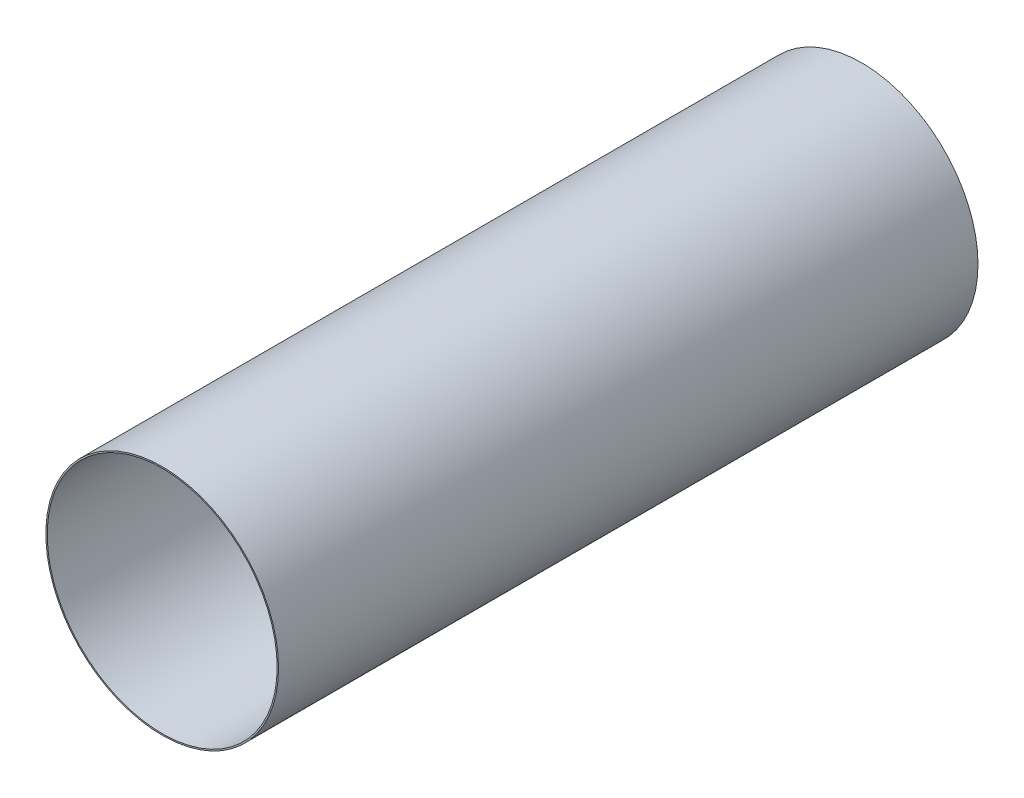
ISO-10303-21;
HEADER;
FILE_DESCRIPTION(('STEP AP214'),'2;1');
FILE_NAME('part.step','',(''),(''),'','','');
FILE_SCHEMA(('AUTOMOTIVE_DESIGN { 1 0 10303 214 1 1 1 1 }'));
ENDSEC;
DATA;
#1=APPLICATION_CONTEXT('core data for automotive mechanical design processes');
#2=APPLICATION_PROTOCOL_DEFINITION('international standard','automotive_design',2000,#1);
#3=PRODUCT_CONTEXT('',#1,'mechanical');
#4=PRODUCT('Part','Part','',(#3));
#5=PRODUCT_RELATED_PRODUCT_CATEGORY('part','',(#4));
#6=PRODUCT_DEFINITION_FORMATION('','',#4);
#7=PRODUCT_DEFINITION_CONTEXT('part definition',#1,'design');
#8=PRODUCT_DEFINITION('design','',#6,#7);
#9=PRODUCT_DEFINITION_SHAPE('','',#8);
#10=(LENGTH_UNIT() NAMED_UNIT(*) SI_UNIT(.MILLI.,.METRE.));
#11=(NAMED_UNIT(*) PLANE_ANGLE_UNIT() SI_UNIT($,.RADIAN.));
#12=(NAMED_UNIT(*) SI_UNIT($,.STERADIAN.) SOLID_ANGLE_UNIT());
#13=UNCERTAINTY_MEASURE_WITH_UNIT(LENGTH_MEASURE(1.E-05),#10,'distance_accuracy_value','');
#14=(GEOMETRIC_REPRESENTATION_CONTEXT(3) GLOBAL_UNCERTAINTY_ASSIGNED_CONTEXT((#13)) GLOBAL_UNIT_ASSIGNED_CONTEXT((#10,
#11,#12)) REPRESENTATION_CONTEXT('',''));
#15=CARTESIAN_POINT('',(0.,0.,0.));
#16=DIRECTION('',(0.,0.,1.));
#17=DIRECTION('',(1.,0.,0.));
#18=AXIS2_PLACEMENT_3D('',#15,#16,#17);
#19=CARTESIAN_POINT('',(0.,0.,25.4));
#20=DIRECTION('',(0.,0.,-1.));
#21=DIRECTION('',(-1.,0.,0.));
#22=AXIS2_PLACEMENT_3D('',#19,#20,#21);
#23=PLANE('',#22);
#24=CARTESIAN_POINT('',(0.,0.,25.4));
#25=DIRECTION('',(0.,0.,-1.));
#26=DIRECTION('',(-1.,0.,0.));
#27=AXIS2_PLACEMENT_3D('',#24,#25,#26);
#28=CIRCLE('',#27,8.45);
#29=CARTESIAN_POINT('',(8.45,0.,25.4));
#30=VERTEX_POINT('',#29);
#31=EDGE_CURVE('E10',#30,#30,#28,.T.);
#32=ORIENTED_EDGE('',*,*,#31,.F.);
#33=EDGE_LOOP('',(#32));
#34=FACE_BOUND('',#33,.T.);
#35=CARTESIAN_POINT('',(0.,0.,25.4));
#36=DIRECTION('',(0.,0.,-1.));
#37=DIRECTION('',(-1.,0.,0.));
#38=AXIS2_PLACEMENT_3D('',#35,#36,#37);
#39=CIRCLE('',#38,8.35);
#40=CARTESIAN_POINT('',(8.35,0.,25.4));
#41=VERTEX_POINT('',#40);
#42=EDGE_CURVE('E36',#41,#41,#39,.T.);
#43=ORIENTED_EDGE('',*,*,#42,.T.);
#44=EDGE_LOOP('',(#43));
#45=FACE_BOUND('',#44,.T.);
#46=ADVANCED_FACE('F15',(#34,#45),#23,.F.);
#47=CARTESIAN_POINT('',(0.,0.,0.));
#48=DIRECTION('',(0.,0.,-1.));
#49=DIRECTION('',(-1.,0.,0.));
#50=AXIS2_PLACEMENT_3D('',#47,#48,#49);
#51=CYLINDRICAL_SURFACE('',#50,8.45);
#52=ORIENTED_EDGE('',*,*,#31,.T.);
#53=EDGE_LOOP('',(#52));
#54=FACE_BOUND('',#53,.T.);
#55=CARTESIAN_POINT('',(0.,0.,-25.4));
#56=DIRECTION('',(0.,0.,1.));
#57=DIRECTION('',(-1.,0.,0.));
#58=AXIS2_PLACEMENT_3D('',#55,#56,#57);
#59=CIRCLE('',#58,8.45);
#60=CARTESIAN_POINT('',(8.45,0.,-25.4));
#61=VERTEX_POINT('',#60);
#62=EDGE_CURVE('E25',#61,#61,#59,.T.);
#63=ORIENTED_EDGE('',*,*,#62,.T.);
#64=EDGE_LOOP('',(#63));
#65=FACE_BOUND('',#64,.T.);
#66=ADVANCED_FACE('F17',(#54,#65),#51,.T.);
#67=CARTESIAN_POINT('',(0.,0.,-25.4));
#68=DIRECTION('',(0.,0.,-1.));
#69=DIRECTION('',(-1.,0.,0.));
#70=AXIS2_PLACEMENT_3D('',#67,#68,#69);
#71=PLANE('',#70);
#72=ORIENTED_EDGE('',*,*,#62,.F.);
#73=EDGE_LOOP('',(#72));
#74=FACE_BOUND('',#73,.T.);
#75=CARTESIAN_POINT('',(0.,0.,-25.4));
#76=DIRECTION('',(0.,0.,1.));
#77=DIRECTION('',(-1.,0.,0.));
#78=AXIS2_PLACEMENT_3D('',#75,#76,#77);
#79=CIRCLE('',#78,8.35);
#80=CARTESIAN_POINT('',(8.35,0.,-25.4));
#81=VERTEX_POINT('',#80);
#82=EDGE_CURVE('E40',#81,#81,#79,.T.);
#83=ORIENTED_EDGE('',*,*,#82,.T.);
#84=EDGE_LOOP('',(#83));
#85=FACE_BOUND('',#84,.T.);
#86=ADVANCED_FACE('F41',(#74,#85),#71,.T.);
#87=CARTESIAN_POINT('',(0.,0.,0.));
#88=DIRECTION('',(0.,0.,-1.));
#89=DIRECTION('',(-1.,0.,0.));
#90=AXIS2_PLACEMENT_3D('',#87,#88,#89);
#91=CYLINDRICAL_SURFACE('',#90,8.35);
#92=ORIENTED_EDGE('',*,*,#42,.F.);
#93=EDGE_LOOP('',(#92));
#94=FACE_BOUND('',#93,.T.);
#95=ORIENTED_EDGE('',*,*,#82,.F.);
#96=EDGE_LOOP('',(#95));
#97=FACE_BOUND('',#96,.T.);
#98=ADVANCED_FACE('F53',(#94,#97),#91,.F.);
#99=CLOSED_SHELL('',(#46,#66,#86,#98));
#100=MANIFOLD_SOLID_BREP('B1',#99);
#101=ADVANCED_BREP_SHAPE_REPRESENTATION('',(#18,#100),#14);
#102=SHAPE_DEFINITION_REPRESENTATION(#9,#101);
ENDSEC;
END-ISO-10303-21;
